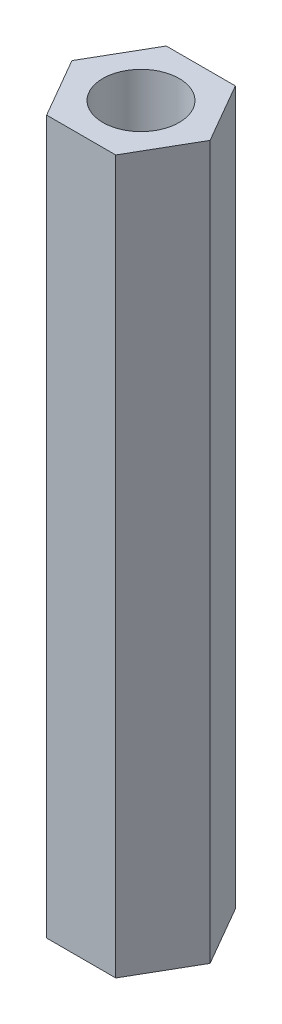
ISO-10303-21;
HEADER;
FILE_DESCRIPTION(('STEP AP214'),'2;1');
FILE_NAME('part.step','',(''),(''),'','','');
FILE_SCHEMA(('AUTOMOTIVE_DESIGN { 1 0 10303 214 1 1 1 1 }'));
ENDSEC;
DATA;
#1=APPLICATION_CONTEXT('core data for automotive mechanical design processes');
#2=APPLICATION_PROTOCOL_DEFINITION('international standard','automotive_design',2000,#1);
#3=PRODUCT_CONTEXT('',#1,'mechanical');
#4=PRODUCT('Part','Part','',(#3));
#5=PRODUCT_RELATED_PRODUCT_CATEGORY('part','',(#4));
#6=PRODUCT_DEFINITION_FORMATION('','',#4);
#7=PRODUCT_DEFINITION_CONTEXT('part definition',#1,'design');
#8=PRODUCT_DEFINITION('design','',#6,#7);
#9=PRODUCT_DEFINITION_SHAPE('','',#8);
#10=(LENGTH_UNIT() NAMED_UNIT(*) SI_UNIT(.MILLI.,.METRE.));
#11=(NAMED_UNIT(*) PLANE_ANGLE_UNIT() SI_UNIT($,.RADIAN.));
#12=(NAMED_UNIT(*) SI_UNIT($,.STERADIAN.) SOLID_ANGLE_UNIT());
#13=UNCERTAINTY_MEASURE_WITH_UNIT(LENGTH_MEASURE(1.E-05),#10,'distance_accuracy_value','');
#14=(GEOMETRIC_REPRESENTATION_CONTEXT(3) GLOBAL_UNCERTAINTY_ASSIGNED_CONTEXT((#13)) GLOBAL_UNIT_ASSIGNED_CONTEXT((#10,
#11,#12)) REPRESENTATION_CONTEXT('',''));
#15=CARTESIAN_POINT('',(0.,0.,0.));
#16=DIRECTION('',(0.,0.,1.));
#17=DIRECTION('',(1.,0.,0.));
#18=AXIS2_PLACEMENT_3D('',#15,#16,#17);
#19=CARTESIAN_POINT('',(0.,28.,0.));
#20=DIRECTION('',(0.,1.,0.));
#21=DIRECTION('',(0.,0.,1.));
#22=AXIS2_PLACEMENT_3D('',#19,#20,#21);
#23=PLANE('',#22);
#24=DIRECTION('',(-0.5,0.,0.866025403784438));
#25=VECTOR('',#24,1.);
#26=CARTESIAN_POINT('',(-1.35677313259562,28.,-2.35));
#27=LINE('',#26,#25);
#28=CARTESIAN_POINT('',(-1.35677313259562,28.,-2.35));
#29=VERTEX_POINT('',#28);
#30=CARTESIAN_POINT('',(-2.71354626519124,28.,0.));
#31=VERTEX_POINT('',#30);
#32=EDGE_CURVE('E146',#29,#31,#27,.T.);
#33=ORIENTED_EDGE('',*,*,#32,.T.);
#34=DIRECTION('',(0.5,0.,0.866025403784439));
#35=VECTOR('',#34,1.);
#36=CARTESIAN_POINT('',(-2.71354626519124,28.,0.));
#37=LINE('',#36,#35);
#38=CARTESIAN_POINT('',(-1.35677313259562,28.,2.35));
#39=VERTEX_POINT('',#38);
#40=EDGE_CURVE('E94',#31,#39,#37,.T.);
#41=ORIENTED_EDGE('',*,*,#40,.T.);
#42=DIRECTION('',(1.,0.,0.));
#43=VECTOR('',#42,1.);
#44=CARTESIAN_POINT('',(-1.35677313259562,28.,2.35));
#45=LINE('',#44,#43);
#46=CARTESIAN_POINT('',(1.35677313259562,28.,2.35));
#47=VERTEX_POINT('',#46);
#48=EDGE_CURVE('E107',#39,#47,#45,.T.);
#49=ORIENTED_EDGE('',*,*,#48,.T.);
#50=DIRECTION('',(0.5,0.,-0.866025403784439));
#51=VECTOR('',#50,1.);
#52=CARTESIAN_POINT('',(1.35677313259562,28.,2.35));
#53=LINE('',#52,#51);
#54=CARTESIAN_POINT('',(2.71354626519124,28.,0.));
#55=VERTEX_POINT('',#54);
#56=EDGE_CURVE('E101',#47,#55,#53,.T.);
#57=ORIENTED_EDGE('',*,*,#56,.T.);
#58=DIRECTION('',(-0.5,0.,-0.866025403784439));
#59=VECTOR('',#58,1.);
#60=CARTESIAN_POINT('',(2.71354626519124,28.,0.));
#61=LINE('',#60,#59);
#62=CARTESIAN_POINT('',(1.35677313259562,28.,-2.35));
#63=VERTEX_POINT('',#62);
#64=EDGE_CURVE('E105',#55,#63,#61,.T.);
#65=ORIENTED_EDGE('',*,*,#64,.T.);
#66=DIRECTION('',(-1.,0.,0.));
#67=VECTOR('',#66,1.);
#68=CARTESIAN_POINT('',(1.35677313259562,28.,-2.35));
#69=LINE('',#68,#67);
#70=EDGE_CURVE('E57',#63,#29,#69,.T.);
#71=ORIENTED_EDGE('',*,*,#70,.T.);
#72=EDGE_LOOP('',(#33,#41,#49,#57,#65,#71));
#73=FACE_BOUND('',#72,.T.);
#74=CARTESIAN_POINT('',(0.,28.,0.));
#75=DIRECTION('',(0.,1.,0.));
#76=DIRECTION('',(0.,0.,1.));
#77=AXIS2_PLACEMENT_3D('',#74,#75,#76);
#78=CIRCLE('',#77,1.5);
#79=CARTESIAN_POINT('',(0.,28.,1.5));
#80=VERTEX_POINT('',#79);
#81=EDGE_CURVE('E134',#80,#80,#78,.T.);
#82=ORIENTED_EDGE('',*,*,#81,.F.);
#83=EDGE_LOOP('',(#82));
#84=FACE_BOUND('',#83,.T.);
#85=ADVANCED_FACE('F39',(#73,#84),#23,.T.);
#86=CARTESIAN_POINT('',(0.,0.,0.));
#87=DIRECTION('',(0.,1.,0.));
#88=DIRECTION('',(0.,0.,1.));
#89=AXIS2_PLACEMENT_3D('',#86,#87,#88);
#90=PLANE('',#89);
#91=DIRECTION('',(-0.5,0.,0.866025403784438));
#92=VECTOR('',#91,1.);
#93=CARTESIAN_POINT('',(-1.35677313259562,0.,-2.35));
#94=LINE('',#93,#92);
#95=CARTESIAN_POINT('',(-1.35677313259562,0.,-2.35));
#96=VERTEX_POINT('',#95);
#97=CARTESIAN_POINT('',(-2.71354626519124,0.,0.));
#98=VERTEX_POINT('',#97);
#99=EDGE_CURVE('E129',#96,#98,#94,.T.);
#100=ORIENTED_EDGE('',*,*,#99,.F.);
#101=DIRECTION('',(-1.,0.,0.));
#102=VECTOR('',#101,1.);
#103=CARTESIAN_POINT('',(1.35677313259562,0.,-2.35));
#104=LINE('',#103,#102);
#105=CARTESIAN_POINT('',(1.35677313259562,0.,-2.35));
#106=VERTEX_POINT('',#105);
#107=EDGE_CURVE('E86',#106,#96,#104,.T.);
#108=ORIENTED_EDGE('',*,*,#107,.F.);
#109=DIRECTION('',(-0.5,0.,-0.866025403784439));
#110=VECTOR('',#109,1.);
#111=CARTESIAN_POINT('',(2.71354626519124,0.,0.));
#112=LINE('',#111,#110);
#113=CARTESIAN_POINT('',(2.71354626519124,0.,0.));
#114=VERTEX_POINT('',#113);
#115=EDGE_CURVE('E80',#114,#106,#112,.T.);
#116=ORIENTED_EDGE('',*,*,#115,.F.);
#117=DIRECTION('',(0.5,0.,-0.866025403784439));
#118=VECTOR('',#117,1.);
#119=CARTESIAN_POINT('',(1.35677313259562,0.,2.35));
#120=LINE('',#119,#118);
#121=CARTESIAN_POINT('',(1.35677313259562,0.,2.35));
#122=VERTEX_POINT('',#121);
#123=EDGE_CURVE('E116',#122,#114,#120,.T.);
#124=ORIENTED_EDGE('',*,*,#123,.F.);
#125=DIRECTION('',(1.,0.,0.));
#126=VECTOR('',#125,1.);
#127=CARTESIAN_POINT('',(-1.35677313259562,0.,2.35));
#128=LINE('',#127,#126);
#129=CARTESIAN_POINT('',(-1.35677313259562,0.,2.35));
#130=VERTEX_POINT('',#129);
#131=EDGE_CURVE('E137',#130,#122,#128,.T.);
#132=ORIENTED_EDGE('',*,*,#131,.F.);
#133=DIRECTION('',(0.5,0.,0.866025403784439));
#134=VECTOR('',#133,1.);
#135=CARTESIAN_POINT('',(-2.71354626519124,0.,0.));
#136=LINE('',#135,#134);
#137=EDGE_CURVE('E133',#98,#130,#136,.T.);
#138=ORIENTED_EDGE('',*,*,#137,.F.);
#139=EDGE_LOOP('',(#100,#108,#116,#124,#132,#138));
#140=FACE_BOUND('',#139,.T.);
#141=CARTESIAN_POINT('',(0.,0.,0.));
#142=DIRECTION('',(0.,1.,0.));
#143=DIRECTION('',(0.,0.,1.));
#144=AXIS2_PLACEMENT_3D('',#141,#142,#143);
#145=CIRCLE('',#144,1.5);
#146=CARTESIAN_POINT('',(0.,0.,1.5));
#147=VERTEX_POINT('',#146);
#148=EDGE_CURVE('E243',#147,#147,#145,.T.);
#149=ORIENTED_EDGE('',*,*,#148,.T.);
#150=EDGE_LOOP('',(#149));
#151=FACE_BOUND('',#150,.T.);
#152=ADVANCED_FACE('F159',(#140,#151),#90,.F.);
#153=CARTESIAN_POINT('',(-1.35677313259562,28.,-2.35));
#154=DIRECTION('',(0.866025403784438,0.,0.5));
#155=DIRECTION('',(0.5,0.,-0.866025403784439));
#156=AXIS2_PLACEMENT_3D('',#153,#154,#155);
#157=PLANE('',#156);
#158=ORIENTED_EDGE('',*,*,#99,.T.);
#159=DIRECTION('',(0.,-1.,0.));
#160=VECTOR('',#159,1.);
#161=CARTESIAN_POINT('',(-2.71354626519124,28.,0.));
#162=LINE('',#161,#160);
#163=EDGE_CURVE('E11',#31,#98,#162,.T.);
#164=ORIENTED_EDGE('',*,*,#163,.F.);
#165=ORIENTED_EDGE('',*,*,#32,.F.);
#166=DIRECTION('',(0.,-1.,0.));
#167=VECTOR('',#166,1.);
#168=CARTESIAN_POINT('',(-1.35677313259562,28.,-2.35));
#169=LINE('',#168,#167);
#170=EDGE_CURVE('E125',#29,#96,#169,.T.);
#171=ORIENTED_EDGE('',*,*,#170,.T.);
#172=EDGE_LOOP('',(#158,#164,#165,#171));
#173=FACE_BOUND('',#172,.T.);
#174=ADVANCED_FACE('F41',(#173),#157,.F.);
#175=CARTESIAN_POINT('',(-2.71354626519124,28.,0.));
#176=DIRECTION('',(0.866025403784439,0.,-0.5));
#177=DIRECTION('',(-0.5,0.,-0.866025403784439));
#178=AXIS2_PLACEMENT_3D('',#175,#176,#177);
#179=PLANE('',#178);
#180=ORIENTED_EDGE('',*,*,#137,.T.);
#181=DIRECTION('',(0.,-1.,0.));
#182=VECTOR('',#181,1.);
#183=CARTESIAN_POINT('',(-1.35677313259562,28.,2.35));
#184=LINE('',#183,#182);
#185=EDGE_CURVE('E49',#39,#130,#184,.T.);
#186=ORIENTED_EDGE('',*,*,#185,.F.);
#187=ORIENTED_EDGE('',*,*,#40,.F.);
#188=ORIENTED_EDGE('',*,*,#163,.T.);
#189=EDGE_LOOP('',(#180,#186,#187,#188));
#190=FACE_BOUND('',#189,.T.);
#191=ADVANCED_FACE('F184',(#190),#179,.F.);
#192=CARTESIAN_POINT('',(-1.35677313259562,28.,2.35));
#193=DIRECTION('',(0.,0.,-1.));
#194=DIRECTION('',(-1.,0.,0.));
#195=AXIS2_PLACEMENT_3D('',#192,#193,#194);
#196=PLANE('',#195);
#197=ORIENTED_EDGE('',*,*,#131,.T.);
#198=DIRECTION('',(0.,-1.,0.));
#199=VECTOR('',#198,1.);
#200=CARTESIAN_POINT('',(1.35677313259562,28.,2.35));
#201=LINE('',#200,#199);
#202=EDGE_CURVE('E118',#47,#122,#201,.T.);
#203=ORIENTED_EDGE('',*,*,#202,.F.);
#204=ORIENTED_EDGE('',*,*,#48,.F.);
#205=ORIENTED_EDGE('',*,*,#185,.T.);
#206=EDGE_LOOP('',(#197,#203,#204,#205));
#207=FACE_BOUND('',#206,.T.);
#208=ADVANCED_FACE('F156',(#207),#196,.F.);
#209=CARTESIAN_POINT('',(1.35677313259562,28.,2.35));
#210=DIRECTION('',(-0.866025403784439,0.,-0.5));
#211=DIRECTION('',(-0.5,0.,0.866025403784439));
#212=AXIS2_PLACEMENT_3D('',#209,#210,#211);
#213=PLANE('',#212);
#214=ORIENTED_EDGE('',*,*,#123,.T.);
#215=DIRECTION('',(0.,-1.,0.));
#216=VECTOR('',#215,1.);
#217=CARTESIAN_POINT('',(2.71354626519124,28.,0.));
#218=LINE('',#217,#216);
#219=EDGE_CURVE('E113',#55,#114,#218,.T.);
#220=ORIENTED_EDGE('',*,*,#219,.F.);
#221=ORIENTED_EDGE('',*,*,#56,.F.);
#222=ORIENTED_EDGE('',*,*,#202,.T.);
#223=EDGE_LOOP('',(#214,#220,#221,#222));
#224=FACE_BOUND('',#223,.T.);
#225=ADVANCED_FACE('F114',(#224),#213,.F.);
#226=CARTESIAN_POINT('',(2.71354626519124,28.,0.));
#227=DIRECTION('',(-0.866025403784439,0.,0.5));
#228=DIRECTION('',(0.5,0.,0.866025403784439));
#229=AXIS2_PLACEMENT_3D('',#226,#227,#228);
#230=PLANE('',#229);
#231=ORIENTED_EDGE('',*,*,#115,.T.);
#232=DIRECTION('',(0.,-1.,0.));
#233=VECTOR('',#232,1.);
#234=CARTESIAN_POINT('',(1.35677313259562,28.,-2.35));
#235=LINE('',#234,#233);
#236=EDGE_CURVE('E119',#63,#106,#235,.T.);
#237=ORIENTED_EDGE('',*,*,#236,.F.);
#238=ORIENTED_EDGE('',*,*,#64,.F.);
#239=ORIENTED_EDGE('',*,*,#219,.T.);
#240=EDGE_LOOP('',(#231,#237,#238,#239));
#241=FACE_BOUND('',#240,.T.);
#242=ADVANCED_FACE('F121',(#241),#230,.F.);
#243=CARTESIAN_POINT('',(1.35677313259562,28.,-2.35));
#244=DIRECTION('',(0.,0.,1.));
#245=DIRECTION('',(1.,0.,0.));
#246=AXIS2_PLACEMENT_3D('',#243,#244,#245);
#247=PLANE('',#246);
#248=ORIENTED_EDGE('',*,*,#107,.T.);
#249=ORIENTED_EDGE('',*,*,#170,.F.);
#250=ORIENTED_EDGE('',*,*,#70,.F.);
#251=ORIENTED_EDGE('',*,*,#236,.T.);
#252=EDGE_LOOP('',(#248,#249,#250,#251));
#253=FACE_BOUND('',#252,.T.);
#254=ADVANCED_FACE('F164',(#253),#247,.F.);
#255=CARTESIAN_POINT('',(0.,28.,0.));
#256=DIRECTION('',(0.,-1.,0.));
#257=DIRECTION('',(0.,0.,-1.));
#258=AXIS2_PLACEMENT_3D('',#255,#256,#257);
#259=CYLINDRICAL_SURFACE('',#258,1.5);
#260=ORIENTED_EDGE('',*,*,#81,.T.);
#261=EDGE_LOOP('',(#260));
#262=FACE_BOUND('',#261,.T.);
#263=ORIENTED_EDGE('',*,*,#148,.F.);
#264=EDGE_LOOP('',(#263));
#265=FACE_BOUND('',#264,.T.);
#266=ADVANCED_FACE('F166',(#262,#265),#259,.F.);
#267=CLOSED_SHELL('',(#85,#152,#174,#191,#208,#225,#242,#254,#266));
#268=MANIFOLD_SOLID_BREP('B2',#267);
#269=ADVANCED_BREP_SHAPE_REPRESENTATION('',(#18,#268),#14);
#270=SHAPE_DEFINITION_REPRESENTATION(#9,#269);
ENDSEC;
END-ISO-10303-21;
